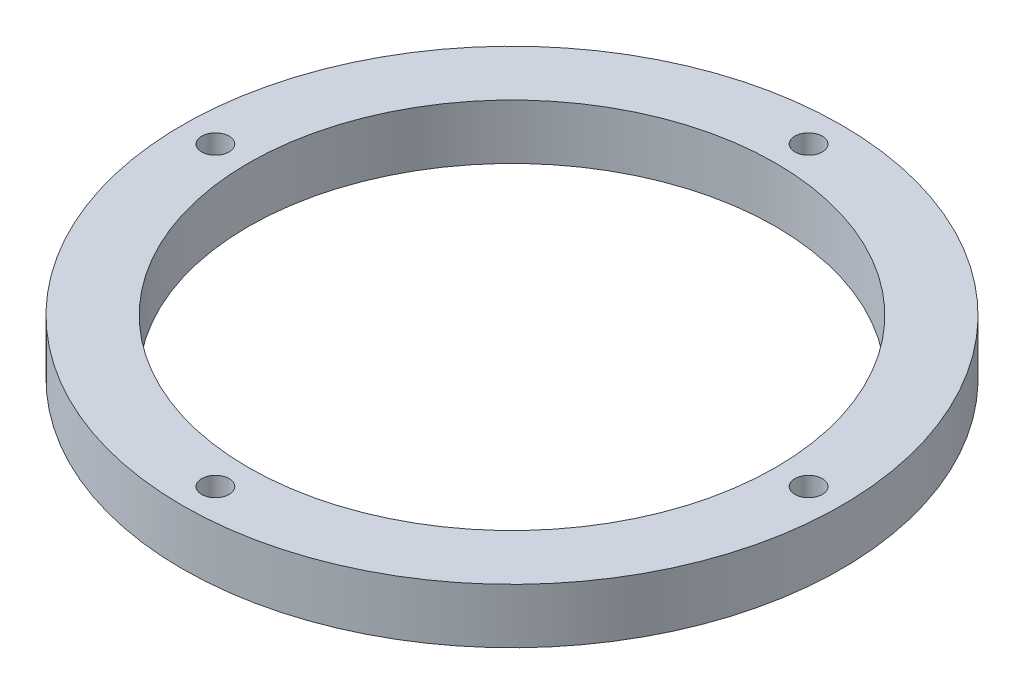
ISO-10303-21;
HEADER;
FILE_DESCRIPTION(('STEP AP214'),'2;1');
FILE_NAME('part.step','',(''),(''),'','','');
FILE_SCHEMA(('AUTOMOTIVE_DESIGN { 1 0 10303 214 1 1 1 1 }'));
ENDSEC;
DATA;
#1=APPLICATION_CONTEXT('core data for automotive mechanical design processes');
#2=APPLICATION_PROTOCOL_DEFINITION('international standard','automotive_design',2000,#1);
#3=PRODUCT_CONTEXT('',#1,'mechanical');
#4=PRODUCT('Part','Part','',(#3));
#5=PRODUCT_RELATED_PRODUCT_CATEGORY('part','',(#4));
#6=PRODUCT_DEFINITION_FORMATION('','',#4);
#7=PRODUCT_DEFINITION_CONTEXT('part definition',#1,'design');
#8=PRODUCT_DEFINITION('design','',#6,#7);
#9=PRODUCT_DEFINITION_SHAPE('','',#8);
#10=(LENGTH_UNIT() NAMED_UNIT(*) SI_UNIT(.MILLI.,.METRE.));
#11=(NAMED_UNIT(*) PLANE_ANGLE_UNIT() SI_UNIT($,.RADIAN.));
#12=(NAMED_UNIT(*) SI_UNIT($,.STERADIAN.) SOLID_ANGLE_UNIT());
#13=UNCERTAINTY_MEASURE_WITH_UNIT(LENGTH_MEASURE(1.E-05),#10,'distance_accuracy_value','');
#14=(GEOMETRIC_REPRESENTATION_CONTEXT(3) GLOBAL_UNCERTAINTY_ASSIGNED_CONTEXT((#13)) GLOBAL_UNIT_ASSIGNED_CONTEXT((#10,
#11,#12)) REPRESENTATION_CONTEXT('',''));
#15=CARTESIAN_POINT('',(0.,0.,0.));
#16=DIRECTION('',(0.,0.,1.));
#17=DIRECTION('',(1.,0.,0.));
#18=AXIS2_PLACEMENT_3D('',#15,#16,#17);
#19=CARTESIAN_POINT('',(0.,10.,0.));
#20=DIRECTION('',(0.,1.,0.));
#21=DIRECTION('',(0.,0.,1.));
#22=AXIS2_PLACEMENT_3D('',#19,#20,#21);
#23=PLANE('',#22);
#24=CARTESIAN_POINT('',(54.,10.,0.));
#25=DIRECTION('',(0.,1.,0.));
#26=DIRECTION('',(0.,0.,1.));
#27=AXIS2_PLACEMENT_3D('',#24,#25,#26);
#28=CIRCLE('',#27,2.5);
#29=CARTESIAN_POINT('',(54.,10.,2.49999999999999));
#30=VERTEX_POINT('',#29);
#31=EDGE_CURVE('E64',#30,#30,#28,.T.);
#32=ORIENTED_EDGE('',*,*,#31,.F.);
#33=EDGE_LOOP('',(#32));
#34=FACE_BOUND('',#33,.T.);
#35=CARTESIAN_POINT('',(-54.,10.,0.));
#36=DIRECTION('',(0.,1.,0.));
#37=DIRECTION('',(0.,0.,1.));
#38=AXIS2_PLACEMENT_3D('',#35,#36,#37);
#39=CIRCLE('',#38,2.5);
#40=CARTESIAN_POINT('',(-54.,10.,2.50000000000001));
#41=VERTEX_POINT('',#40);
#42=EDGE_CURVE('E52',#41,#41,#39,.T.);
#43=ORIENTED_EDGE('',*,*,#42,.F.);
#44=EDGE_LOOP('',(#43));
#45=FACE_BOUND('',#44,.T.);
#46=CARTESIAN_POINT('',(0.,10.,0.));
#47=DIRECTION('',(0.,1.,0.));
#48=DIRECTION('',(0.,0.,1.));
#49=AXIS2_PLACEMENT_3D('',#46,#47,#48);
#50=CIRCLE('',#49,60.);
#51=CARTESIAN_POINT('',(0.,10.,60.));
#52=VERTEX_POINT('',#51);
#53=EDGE_CURVE('E10',#52,#52,#50,.T.);
#54=ORIENTED_EDGE('',*,*,#53,.T.);
#55=EDGE_LOOP('',(#54));
#56=FACE_BOUND('',#55,.T.);
#57=CARTESIAN_POINT('',(0.,10.,0.));
#58=DIRECTION('',(0.,1.,0.));
#59=DIRECTION('',(0.,0.,1.));
#60=AXIS2_PLACEMENT_3D('',#57,#58,#59);
#61=CIRCLE('',#60,48.);
#62=CARTESIAN_POINT('',(0.,10.,48.));
#63=VERTEX_POINT('',#62);
#64=EDGE_CURVE('E47',#63,#63,#61,.T.);
#65=ORIENTED_EDGE('',*,*,#64,.F.);
#66=EDGE_LOOP('',(#65));
#67=FACE_BOUND('',#66,.T.);
#68=CARTESIAN_POINT('',(0.,10.,-54.));
#69=DIRECTION('',(0.,1.,0.));
#70=DIRECTION('',(0.,0.,1.));
#71=AXIS2_PLACEMENT_3D('',#68,#69,#70);
#72=CIRCLE('',#71,2.5);
#73=CARTESIAN_POINT('',(0.,10.,-51.5));
#74=VERTEX_POINT('',#73);
#75=EDGE_CURVE('E58',#74,#74,#72,.T.);
#76=ORIENTED_EDGE('',*,*,#75,.F.);
#77=EDGE_LOOP('',(#76));
#78=FACE_BOUND('',#77,.T.);
#79=CARTESIAN_POINT('',(0.,10.,54.));
#80=DIRECTION('',(0.,1.,0.));
#81=DIRECTION('',(0.,0.,1.));
#82=AXIS2_PLACEMENT_3D('',#79,#80,#81);
#83=CIRCLE('',#82,2.5);
#84=CARTESIAN_POINT('',(0.,10.,56.5));
#85=VERTEX_POINT('',#84);
#86=EDGE_CURVE('E70',#85,#85,#83,.T.);
#87=ORIENTED_EDGE('',*,*,#86,.F.);
#88=EDGE_LOOP('',(#87));
#89=FACE_BOUND('',#88,.T.);
#90=ADVANCED_FACE('F36',(#34,#45,#56,#67,#78,#89),#23,.T.);
#91=CARTESIAN_POINT('',(0.,0.,0.));
#92=DIRECTION('',(0.,1.,0.));
#93=DIRECTION('',(0.,0.,1.));
#94=AXIS2_PLACEMENT_3D('',#91,#92,#93);
#95=PLANE('',#94);
#96=CARTESIAN_POINT('',(0.,0.,0.));
#97=DIRECTION('',(0.,1.,0.));
#98=DIRECTION('',(0.,0.,1.));
#99=AXIS2_PLACEMENT_3D('',#96,#97,#98);
#100=CIRCLE('',#99,60.);
#101=CARTESIAN_POINT('',(0.,0.,60.));
#102=VERTEX_POINT('',#101);
#103=EDGE_CURVE('E40',#102,#102,#100,.T.);
#104=ORIENTED_EDGE('',*,*,#103,.F.);
#105=EDGE_LOOP('',(#104));
#106=FACE_BOUND('',#105,.T.);
#107=CARTESIAN_POINT('',(0.,0.,0.));
#108=DIRECTION('',(0.,1.,0.));
#109=DIRECTION('',(0.,0.,1.));
#110=AXIS2_PLACEMENT_3D('',#107,#108,#109);
#111=CIRCLE('',#110,48.);
#112=CARTESIAN_POINT('',(0.,0.,48.));
#113=VERTEX_POINT('',#112);
#114=EDGE_CURVE('E49',#113,#113,#111,.T.);
#115=ORIENTED_EDGE('',*,*,#114,.T.);
#116=EDGE_LOOP('',(#115));
#117=FACE_BOUND('',#116,.T.);
#118=CARTESIAN_POINT('',(-54.,0.,0.));
#119=DIRECTION('',(0.,1.,0.));
#120=DIRECTION('',(0.,0.,1.));
#121=AXIS2_PLACEMENT_3D('',#118,#119,#120);
#122=CIRCLE('',#121,2.5);
#123=CARTESIAN_POINT('',(-54.,0.,2.50000000000001));
#124=VERTEX_POINT('',#123);
#125=EDGE_CURVE('E55',#124,#124,#122,.T.);
#126=ORIENTED_EDGE('',*,*,#125,.T.);
#127=EDGE_LOOP('',(#126));
#128=FACE_BOUND('',#127,.T.);
#129=CARTESIAN_POINT('',(0.,0.,-54.));
#130=DIRECTION('',(0.,1.,0.));
#131=DIRECTION('',(0.,0.,1.));
#132=AXIS2_PLACEMENT_3D('',#129,#130,#131);
#133=CIRCLE('',#132,2.5);
#134=CARTESIAN_POINT('',(0.,0.,-51.5));
#135=VERTEX_POINT('',#134);
#136=EDGE_CURVE('E61',#135,#135,#133,.T.);
#137=ORIENTED_EDGE('',*,*,#136,.T.);
#138=EDGE_LOOP('',(#137));
#139=FACE_BOUND('',#138,.T.);
#140=CARTESIAN_POINT('',(54.,0.,0.));
#141=DIRECTION('',(0.,1.,0.));
#142=DIRECTION('',(0.,0.,1.));
#143=AXIS2_PLACEMENT_3D('',#140,#141,#142);
#144=CIRCLE('',#143,2.5);
#145=CARTESIAN_POINT('',(54.,0.,2.49999999999999));
#146=VERTEX_POINT('',#145);
#147=EDGE_CURVE('E67',#146,#146,#144,.T.);
#148=ORIENTED_EDGE('',*,*,#147,.T.);
#149=EDGE_LOOP('',(#148));
#150=FACE_BOUND('',#149,.T.);
#151=CARTESIAN_POINT('',(0.,0.,54.));
#152=DIRECTION('',(0.,1.,0.));
#153=DIRECTION('',(0.,0.,1.));
#154=AXIS2_PLACEMENT_3D('',#151,#152,#153);
#155=CIRCLE('',#154,2.5);
#156=CARTESIAN_POINT('',(0.,0.,56.5));
#157=VERTEX_POINT('',#156);
#158=EDGE_CURVE('E73',#157,#157,#155,.T.);
#159=ORIENTED_EDGE('',*,*,#158,.T.);
#160=EDGE_LOOP('',(#159));
#161=FACE_BOUND('',#160,.T.);
#162=ADVANCED_FACE('F83',(#106,#117,#128,#139,#150,#161),#95,.F.);
#163=CARTESIAN_POINT('',(0.,10.,0.));
#164=DIRECTION('',(0.,-1.,0.));
#165=DIRECTION('',(0.,0.,-1.));
#166=AXIS2_PLACEMENT_3D('',#163,#164,#165);
#167=CYLINDRICAL_SURFACE('',#166,60.);
#168=ORIENTED_EDGE('',*,*,#53,.F.);
#169=EDGE_LOOP('',(#168));
#170=FACE_BOUND('',#169,.T.);
#171=ORIENTED_EDGE('',*,*,#103,.T.);
#172=EDGE_LOOP('',(#171));
#173=FACE_BOUND('',#172,.T.);
#174=ADVANCED_FACE('F38',(#170,#173),#167,.T.);
#175=CARTESIAN_POINT('',(0.,10.,0.));
#176=DIRECTION('',(0.,-1.,0.));
#177=DIRECTION('',(0.,0.,-1.));
#178=AXIS2_PLACEMENT_3D('',#175,#176,#177);
#179=CYLINDRICAL_SURFACE('',#178,48.);
#180=ORIENTED_EDGE('',*,*,#64,.T.);
#181=EDGE_LOOP('',(#180));
#182=FACE_BOUND('',#181,.T.);
#183=ORIENTED_EDGE('',*,*,#114,.F.);
#184=EDGE_LOOP('',(#183));
#185=FACE_BOUND('',#184,.T.);
#186=ADVANCED_FACE('F93',(#182,#185),#179,.F.);
#187=CARTESIAN_POINT('',(-54.,10.,0.));
#188=DIRECTION('',(0.,-1.,0.));
#189=DIRECTION('',(0.,0.,-1.));
#190=AXIS2_PLACEMENT_3D('',#187,#188,#189);
#191=CYLINDRICAL_SURFACE('',#190,2.5);
#192=ORIENTED_EDGE('',*,*,#42,.T.);
#193=EDGE_LOOP('',(#192));
#194=FACE_BOUND('',#193,.T.);
#195=ORIENTED_EDGE('',*,*,#125,.F.);
#196=EDGE_LOOP('',(#195));
#197=FACE_BOUND('',#196,.T.);
#198=ADVANCED_FACE('F96',(#194,#197),#191,.F.);
#199=CARTESIAN_POINT('',(0.,10.,-54.));
#200=DIRECTION('',(0.,-1.,0.));
#201=DIRECTION('',(0.,0.,-1.));
#202=AXIS2_PLACEMENT_3D('',#199,#200,#201);
#203=CYLINDRICAL_SURFACE('',#202,2.5);
#204=ORIENTED_EDGE('',*,*,#75,.T.);
#205=EDGE_LOOP('',(#204));
#206=FACE_BOUND('',#205,.T.);
#207=ORIENTED_EDGE('',*,*,#136,.F.);
#208=EDGE_LOOP('',(#207));
#209=FACE_BOUND('',#208,.T.);
#210=ADVANCED_FACE('F100',(#206,#209),#203,.F.);
#211=CARTESIAN_POINT('',(54.,10.,0.));
#212=DIRECTION('',(0.,-1.,0.));
#213=DIRECTION('',(0.,0.,-1.));
#214=AXIS2_PLACEMENT_3D('',#211,#212,#213);
#215=CYLINDRICAL_SURFACE('',#214,2.5);
#216=ORIENTED_EDGE('',*,*,#31,.T.);
#217=EDGE_LOOP('',(#216));
#218=FACE_BOUND('',#217,.T.);
#219=ORIENTED_EDGE('',*,*,#147,.F.);
#220=EDGE_LOOP('',(#219));
#221=FACE_BOUND('',#220,.T.);
#222=ADVANCED_FACE('F104',(#218,#221),#215,.F.);
#223=CARTESIAN_POINT('',(0.,10.,54.));
#224=DIRECTION('',(0.,-1.,0.));
#225=DIRECTION('',(0.,0.,-1.));
#226=AXIS2_PLACEMENT_3D('',#223,#224,#225);
#227=CYLINDRICAL_SURFACE('',#226,2.5);
#228=ORIENTED_EDGE('',*,*,#86,.T.);
#229=EDGE_LOOP('',(#228));
#230=FACE_BOUND('',#229,.T.);
#231=ORIENTED_EDGE('',*,*,#158,.F.);
#232=EDGE_LOOP('',(#231));
#233=FACE_BOUND('',#232,.T.);
#234=ADVANCED_FACE('F79',(#230,#233),#227,.F.);
#235=CLOSED_SHELL('',(#90,#162,#174,#186,#198,#210,#222,#234));
#236=MANIFOLD_SOLID_BREP('B2',#235);
#237=ADVANCED_BREP_SHAPE_REPRESENTATION('',(#18,#236),#14);
#238=SHAPE_DEFINITION_REPRESENTATION(#9,#237);
ENDSEC;
END-ISO-10303-21;
